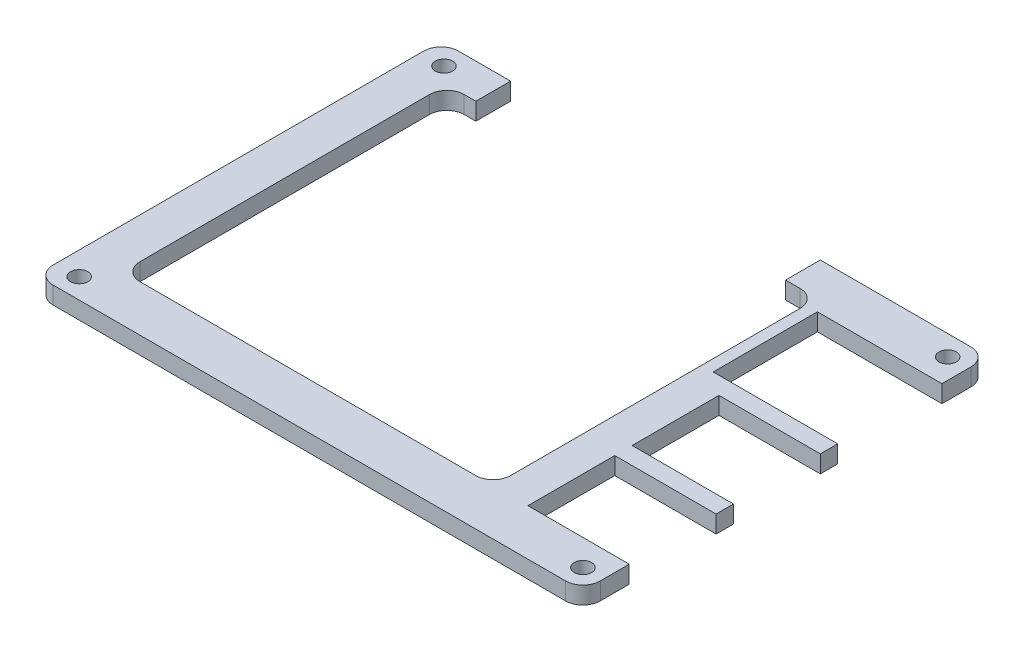
ISO-10303-21;
HEADER;
FILE_DESCRIPTION(('STEP AP214'),'2;1');
FILE_NAME('part.step','',(''),(''),'','','');
FILE_SCHEMA(('AUTOMOTIVE_DESIGN { 1 0 10303 214 1 1 1 1 }'));
ENDSEC;
DATA;
#1=APPLICATION_CONTEXT('core data for automotive mechanical design processes');
#2=APPLICATION_PROTOCOL_DEFINITION('international standard','automotive_design',2000,#1);
#3=PRODUCT_CONTEXT('',#1,'mechanical');
#4=PRODUCT('Part','Part','',(#3));
#5=PRODUCT_RELATED_PRODUCT_CATEGORY('part','',(#4));
#6=PRODUCT_DEFINITION_FORMATION('','',#4);
#7=PRODUCT_DEFINITION_CONTEXT('part definition',#1,'design');
#8=PRODUCT_DEFINITION('design','',#6,#7);
#9=PRODUCT_DEFINITION_SHAPE('','',#8);
#10=(LENGTH_UNIT() NAMED_UNIT(*) SI_UNIT(.MILLI.,.METRE.));
#11=(NAMED_UNIT(*) PLANE_ANGLE_UNIT() SI_UNIT($,.RADIAN.));
#12=(NAMED_UNIT(*) SI_UNIT($,.STERADIAN.) SOLID_ANGLE_UNIT());
#13=UNCERTAINTY_MEASURE_WITH_UNIT(LENGTH_MEASURE(1.E-05),#10,'distance_accuracy_value','');
#14=(GEOMETRIC_REPRESENTATION_CONTEXT(3) GLOBAL_UNCERTAINTY_ASSIGNED_CONTEXT((#13)) GLOBAL_UNIT_ASSIGNED_CONTEXT((#10,
#11,#12)) REPRESENTATION_CONTEXT('',''));
#15=CARTESIAN_POINT('',(0.,0.,0.));
#16=DIRECTION('',(0.,0.,1.));
#17=DIRECTION('',(1.,0.,0.));
#18=AXIS2_PLACEMENT_3D('',#15,#16,#17);
#19=CARTESIAN_POINT('',(47.25,3.,-35.));
#20=DIRECTION('',(-1.,0.,0.));
#21=DIRECTION('',(0.,0.,1.));
#22=AXIS2_PLACEMENT_3D('',#19,#20,#21);
#23=PLANE('',#22);
#24=DIRECTION('',(0.,0.,-1.));
#25=VECTOR('',#24,1.);
#26=CARTESIAN_POINT('',(47.25,3.,-35.));
#27=LINE('',#26,#25);
#28=CARTESIAN_POINT('',(47.25,3.,-27.));
#29=VERTEX_POINT('',#28);
#30=CARTESIAN_POINT('',(47.25,3.,-32.));
#31=VERTEX_POINT('',#30);
#32=EDGE_CURVE('E468',#29,#31,#27,.T.);
#33=ORIENTED_EDGE('',*,*,#32,.F.);
#34=DIRECTION('',(0.,1.,0.));
#35=VECTOR('',#34,1.);
#36=CARTESIAN_POINT('',(47.25,0.,-27.));
#37=LINE('',#36,#35);
#38=CARTESIAN_POINT('',(47.25,0.,-27.));
#39=VERTEX_POINT('',#38);
#40=EDGE_CURVE('E350',#39,#29,#37,.T.);
#41=ORIENTED_EDGE('',*,*,#40,.F.);
#42=DIRECTION('',(0.,0.,-1.));
#43=VECTOR('',#42,1.);
#44=CARTESIAN_POINT('',(47.25,0.,-35.));
#45=LINE('',#44,#43);
#46=CARTESIAN_POINT('',(47.25,0.,-32.));
#47=VERTEX_POINT('',#46);
#48=EDGE_CURVE('E458',#39,#47,#45,.T.);
#49=ORIENTED_EDGE('',*,*,#48,.T.);
#50=DIRECTION('',(0.,-1.,0.));
#51=VECTOR('',#50,1.);
#52=CARTESIAN_POINT('',(47.25,3.,-32.));
#53=LINE('',#52,#51);
#54=EDGE_CURVE('E550',#47,#31,#53,.F.);
#55=ORIENTED_EDGE('',*,*,#54,.T.);
#56=EDGE_LOOP('',(#33,#41,#49,#55));
#57=FACE_BOUND('',#56,.T.);
#58=ADVANCED_FACE('F39',(#57),#23,.F.);
#59=CARTESIAN_POINT('',(47.25,0.,-5.99999999999999));
#60=VERTEX_POINT('',#59);
#61=CARTESIAN_POINT('',(47.25,0.,-8.99999999999999));
#62=VERTEX_POINT('',#61);
#63=EDGE_CURVE('E608',#60,#62,#45,.T.);
#64=ORIENTED_EDGE('',*,*,#63,.T.);
#65=DIRECTION('',(0.,1.,0.));
#66=VECTOR('',#65,1.);
#67=CARTESIAN_POINT('',(47.25,0.,-8.99999999999999));
#68=LINE('',#67,#66);
#69=CARTESIAN_POINT('',(47.25,3.,-8.99999999999999));
#70=VERTEX_POINT('',#69);
#71=EDGE_CURVE('E353',#62,#70,#68,.T.);
#72=ORIENTED_EDGE('',*,*,#71,.T.);
#73=CARTESIAN_POINT('',(47.25,3.,-5.99999999999999));
#74=VERTEX_POINT('',#73);
#75=EDGE_CURVE('E601',#74,#70,#27,.T.);
#76=ORIENTED_EDGE('',*,*,#75,.F.);
#77=DIRECTION('',(0.,1.,0.));
#78=VECTOR('',#77,1.);
#79=CARTESIAN_POINT('',(47.25,0.,-5.99999999999999));
#80=LINE('',#79,#78);
#81=EDGE_CURVE('E386',#60,#74,#80,.T.);
#82=ORIENTED_EDGE('',*,*,#81,.F.);
#83=EDGE_LOOP('',(#64,#72,#76,#82));
#84=FACE_BOUND('',#83,.T.);
#85=ADVANCED_FACE('F639',(#84),#23,.F.);
#86=CARTESIAN_POINT('',(47.25,0.,12.));
#87=VERTEX_POINT('',#86);
#88=CARTESIAN_POINT('',(47.25,0.,9.00000000000001));
#89=VERTEX_POINT('',#88);
#90=EDGE_CURVE('E487',#87,#89,#45,.T.);
#91=ORIENTED_EDGE('',*,*,#90,.T.);
#92=DIRECTION('',(0.,1.,0.));
#93=VECTOR('',#92,1.);
#94=CARTESIAN_POINT('',(47.25,0.,9.00000000000001));
#95=LINE('',#94,#93);
#96=CARTESIAN_POINT('',(47.25,3.,9.00000000000001));
#97=VERTEX_POINT('',#96);
#98=EDGE_CURVE('E389',#89,#97,#95,.T.);
#99=ORIENTED_EDGE('',*,*,#98,.T.);
#100=CARTESIAN_POINT('',(47.25,3.,12.));
#101=VERTEX_POINT('',#100);
#102=EDGE_CURVE('E467',#101,#97,#27,.T.);
#103=ORIENTED_EDGE('',*,*,#102,.F.);
#104=DIRECTION('',(0.,1.,0.));
#105=VECTOR('',#104,1.);
#106=CARTESIAN_POINT('',(47.25,0.,12.));
#107=LINE('',#106,#105);
#108=EDGE_CURVE('E421',#87,#101,#107,.T.);
#109=ORIENTED_EDGE('',*,*,#108,.F.);
#110=EDGE_LOOP('',(#91,#99,#103,#109));
#111=FACE_BOUND('',#110,.T.);
#112=ADVANCED_FACE('F634',(#111),#23,.F.);
#113=CARTESIAN_POINT('',(-47.25,3.,-35.));
#114=DIRECTION('',(0.,0.,1.));
#115=DIRECTION('',(1.,0.,0.));
#116=AXIS2_PLACEMENT_3D('',#113,#114,#115);
#117=PLANE('',#116);
#118=DIRECTION('',(0.,1.,0.));
#119=VECTOR('',#118,1.);
#120=CARTESIAN_POINT('',(-35.25,0.,-35.));
#121=LINE('',#120,#119);
#122=CARTESIAN_POINT('',(-35.25,0.,-35.));
#123=VERTEX_POINT('',#122);
#124=CARTESIAN_POINT('',(-35.25,3.,-35.));
#125=VERTEX_POINT('',#124);
#126=EDGE_CURVE('E318',#123,#125,#121,.T.);
#127=ORIENTED_EDGE('',*,*,#126,.F.);
#128=DIRECTION('',(-1.,0.,0.));
#129=VECTOR('',#128,1.);
#130=CARTESIAN_POINT('',(-47.25,0.,-35.));
#131=LINE('',#130,#129);
#132=CARTESIAN_POINT('',(-44.25,0.,-35.));
#133=VERTEX_POINT('',#132);
#134=EDGE_CURVE('E486',#123,#133,#131,.T.);
#135=ORIENTED_EDGE('',*,*,#134,.T.);
#136=DIRECTION('',(0.,-1.,0.));
#137=VECTOR('',#136,1.);
#138=CARTESIAN_POINT('',(-44.25,3.,-35.));
#139=LINE('',#138,#137);
#140=CARTESIAN_POINT('',(-44.25,3.,-35.));
#141=VERTEX_POINT('',#140);
#142=EDGE_CURVE('E542',#133,#141,#139,.F.);
#143=ORIENTED_EDGE('',*,*,#142,.T.);
#144=DIRECTION('',(-1.,0.,0.));
#145=VECTOR('',#144,1.);
#146=CARTESIAN_POINT('',(-47.25,3.,-35.));
#147=LINE('',#146,#145);
#148=EDGE_CURVE('E466',#125,#141,#147,.T.);
#149=ORIENTED_EDGE('',*,*,#148,.F.);
#150=EDGE_LOOP('',(#127,#135,#143,#149));
#151=FACE_BOUND('',#150,.T.);
#152=ADVANCED_FACE('F626',(#151),#117,.F.);
#153=DIRECTION('',(0.,1.,0.));
#154=VECTOR('',#153,1.);
#155=CARTESIAN_POINT('',(18.25,0.,-35.));
#156=LINE('',#155,#154);
#157=CARTESIAN_POINT('',(18.25,0.,-35.));
#158=VERTEX_POINT('',#157);
#159=CARTESIAN_POINT('',(18.25,3.,-35.));
#160=VERTEX_POINT('',#159);
#161=EDGE_CURVE('E252',#158,#160,#156,.T.);
#162=ORIENTED_EDGE('',*,*,#161,.T.);
#163=CARTESIAN_POINT('',(44.25,3.,-35.));
#164=VERTEX_POINT('',#163);
#165=EDGE_CURVE('E469',#164,#160,#147,.T.);
#166=ORIENTED_EDGE('',*,*,#165,.F.);
#167=DIRECTION('',(0.,-1.,0.));
#168=VECTOR('',#167,1.);
#169=CARTESIAN_POINT('',(44.25,3.,-35.));
#170=LINE('',#169,#168);
#171=CARTESIAN_POINT('',(44.25,0.,-35.));
#172=VERTEX_POINT('',#171);
#173=EDGE_CURVE('E538',#164,#172,#170,.T.);
#174=ORIENTED_EDGE('',*,*,#173,.T.);
#175=EDGE_CURVE('E488',#172,#158,#131,.T.);
#176=ORIENTED_EDGE('',*,*,#175,.T.);
#177=EDGE_LOOP('',(#162,#166,#174,#176));
#178=FACE_BOUND('',#177,.T.);
#179=ADVANCED_FACE('F624',(#178),#117,.F.);
#180=CARTESIAN_POINT('',(0.,3.,0.));
#181=DIRECTION('',(0.,1.,0.));
#182=DIRECTION('',(0.,0.,1.));
#183=AXIS2_PLACEMENT_3D('',#180,#181,#182);
#184=PLANE('',#183);
#185=CARTESIAN_POINT('',(43.75,3.,31.5));
#186=DIRECTION('',(0.,1.,0.));
#187=DIRECTION('',(0.,0.,1.));
#188=AXIS2_PLACEMENT_3D('',#185,#186,#187);
#189=CIRCLE('',#188,1.5);
#190=CARTESIAN_POINT('',(43.75,3.,33.));
#191=VERTEX_POINT('',#190);
#192=EDGE_CURVE('E317',#191,#191,#189,.T.);
#193=ORIENTED_EDGE('',*,*,#192,.F.);
#194=EDGE_LOOP('',(#193));
#195=FACE_BOUND('',#194,.T.);
#196=CARTESIAN_POINT('',(-43.25,3.,31.5));
#197=DIRECTION('',(0.,1.,0.));
#198=DIRECTION('',(0.,0.,1.));
#199=AXIS2_PLACEMENT_3D('',#196,#197,#198);
#200=CIRCLE('',#199,1.5);
#201=CARTESIAN_POINT('',(-43.25,3.,33.));
#202=VERTEX_POINT('',#201);
#203=EDGE_CURVE('E443',#202,#202,#200,.T.);
#204=ORIENTED_EDGE('',*,*,#203,.F.);
#205=EDGE_LOOP('',(#204));
#206=FACE_BOUND('',#205,.T.);
#207=CARTESIAN_POINT('',(-43.25,3.,-31.5));
#208=DIRECTION('',(0.,1.,0.));
#209=DIRECTION('',(0.,0.,1.));
#210=AXIS2_PLACEMENT_3D('',#207,#208,#209);
#211=CIRCLE('',#210,1.5);
#212=CARTESIAN_POINT('',(-43.25,3.,-30.));
#213=VERTEX_POINT('',#212);
#214=EDGE_CURVE('E435',#213,#213,#211,.T.);
#215=ORIENTED_EDGE('',*,*,#214,.F.);
#216=EDGE_LOOP('',(#215));
#217=FACE_BOUND('',#216,.T.);
#218=CARTESIAN_POINT('',(43.75,3.,-31.5));
#219=DIRECTION('',(0.,1.,0.));
#220=DIRECTION('',(0.,0.,1.));
#221=AXIS2_PLACEMENT_3D('',#218,#219,#220);
#222=CIRCLE('',#221,1.5);
#223=CARTESIAN_POINT('',(43.75,3.,-30.));
#224=VERTEX_POINT('',#223);
#225=EDGE_CURVE('E434',#224,#224,#222,.T.);
#226=ORIENTED_EDGE('',*,*,#225,.F.);
#227=EDGE_LOOP('',(#226));
#228=FACE_BOUND('',#227,.T.);
#229=DIRECTION('',(0.,0.,-1.));
#230=VECTOR('',#229,1.);
#231=CARTESIAN_POINT('',(-40.25,3.,0.));
#232=LINE('',#231,#230);
#233=CARTESIAN_POINT('',(-40.25,3.,24.));
#234=VERTEX_POINT('',#233);
#235=CARTESIAN_POINT('',(-40.25,3.,-26.));
#236=VERTEX_POINT('',#235);
#237=EDGE_CURVE('E292',#234,#236,#232,.T.);
#238=ORIENTED_EDGE('',*,*,#237,.T.);
#239=CARTESIAN_POINT('',(-37.25,3.,-26.));
#240=DIRECTION('',(0.,1.,0.));
#241=DIRECTION('',(0.,0.,1.));
#242=AXIS2_PLACEMENT_3D('',#239,#240,#241);
#243=CIRCLE('',#242,3.);
#244=CARTESIAN_POINT('',(-37.25,3.,-29.));
#245=VERTEX_POINT('',#244);
#246=EDGE_CURVE('E48',#236,#245,#243,.F.);
#247=ORIENTED_EDGE('',*,*,#246,.T.);
#248=DIRECTION('',(1.,0.,0.));
#249=VECTOR('',#248,1.);
#250=CARTESIAN_POINT('',(0.,3.,-29.));
#251=LINE('',#250,#249);
#252=CARTESIAN_POINT('',(-35.25,3.,-29.));
#253=VERTEX_POINT('',#252);
#254=EDGE_CURVE('E307',#245,#253,#251,.T.);
#255=ORIENTED_EDGE('',*,*,#254,.T.);
#256=DIRECTION('',(0.,0.,-1.));
#257=VECTOR('',#256,1.);
#258=CARTESIAN_POINT('',(-35.25,3.,0.));
#259=LINE('',#258,#257);
#260=EDGE_CURVE('E310',#253,#125,#259,.T.);
#261=ORIENTED_EDGE('',*,*,#260,.T.);
#262=ORIENTED_EDGE('',*,*,#148,.T.);
#263=CARTESIAN_POINT('',(-44.25,3.,-32.));
#264=DIRECTION('',(0.,1.,0.));
#265=DIRECTION('',(0.,0.,1.));
#266=AXIS2_PLACEMENT_3D('',#263,#264,#265);
#267=CIRCLE('',#266,3.);
#268=CARTESIAN_POINT('',(-47.25,3.,-32.));
#269=VERTEX_POINT('',#268);
#270=EDGE_CURVE('E532',#141,#269,#267,.T.);
#271=ORIENTED_EDGE('',*,*,#270,.T.);
#272=DIRECTION('',(0.,0.,1.));
#273=VECTOR('',#272,1.);
#274=CARTESIAN_POINT('',(-47.25,3.,-35.));
#275=LINE('',#274,#273);
#276=CARTESIAN_POINT('',(-47.25,3.,32.));
#277=VERTEX_POINT('',#276);
#278=EDGE_CURVE('E473',#269,#277,#275,.T.);
#279=ORIENTED_EDGE('',*,*,#278,.T.);
#280=CARTESIAN_POINT('',(-44.25,3.,32.));
#281=DIRECTION('',(0.,1.,0.));
#282=DIRECTION('',(0.,0.,1.));
#283=AXIS2_PLACEMENT_3D('',#280,#281,#282);
#284=CIRCLE('',#283,3.);
#285=CARTESIAN_POINT('',(-44.25,3.,35.));
#286=VERTEX_POINT('',#285);
#287=EDGE_CURVE('E535',#277,#286,#284,.T.);
#288=ORIENTED_EDGE('',*,*,#287,.T.);
#289=DIRECTION('',(1.,0.,0.));
#290=VECTOR('',#289,1.);
#291=CARTESIAN_POINT('',(-47.25,3.,35.));
#292=LINE('',#291,#290);
#293=CARTESIAN_POINT('',(44.25,3.,35.));
#294=VERTEX_POINT('',#293);
#295=EDGE_CURVE('E477',#286,#294,#292,.T.);
#296=ORIENTED_EDGE('',*,*,#295,.T.);
#297=CARTESIAN_POINT('',(44.25,3.,32.));
#298=DIRECTION('',(0.,1.,0.));
#299=DIRECTION('',(0.,0.,1.));
#300=AXIS2_PLACEMENT_3D('',#297,#298,#299);
#301=CIRCLE('',#300,3.);
#302=CARTESIAN_POINT('',(47.25,3.,32.));
#303=VERTEX_POINT('',#302);
#304=EDGE_CURVE('E526',#294,#303,#301,.T.);
#305=ORIENTED_EDGE('',*,*,#304,.T.);
#306=CARTESIAN_POINT('',(47.25,3.,27.));
#307=VERTEX_POINT('',#306);
#308=EDGE_CURVE('E462',#303,#307,#27,.T.);
#309=ORIENTED_EDGE('',*,*,#308,.T.);
#310=DIRECTION('',(1.,0.,0.));
#311=VECTOR('',#310,1.);
#312=CARTESIAN_POINT('',(0.,3.,27.));
#313=LINE('',#312,#311);
#314=CARTESIAN_POINT('',(29.75,3.,27.));
#315=VERTEX_POINT('',#314);
#316=EDGE_CURVE('E413',#315,#307,#313,.T.);
#317=ORIENTED_EDGE('',*,*,#316,.F.);
#318=DIRECTION('',(0.,0.,1.));
#319=VECTOR('',#318,1.);
#320=CARTESIAN_POINT('',(29.75,3.,0.));
#321=LINE('',#320,#319);
#322=CARTESIAN_POINT('',(29.75,3.,12.));
#323=VERTEX_POINT('',#322);
#324=EDGE_CURVE('E409',#323,#315,#321,.T.);
#325=ORIENTED_EDGE('',*,*,#324,.F.);
#326=DIRECTION('',(-1.,0.,0.));
#327=VECTOR('',#326,1.);
#328=CARTESIAN_POINT('',(0.,3.,12.));
#329=LINE('',#328,#327);
#330=EDGE_CURVE('E400',#101,#323,#329,.T.);
#331=ORIENTED_EDGE('',*,*,#330,.F.);
#332=ORIENTED_EDGE('',*,*,#102,.T.);
#333=DIRECTION('',(1.,0.,0.));
#334=VECTOR('',#333,1.);
#335=CARTESIAN_POINT('',(0.,3.,9.00000000000001));
#336=LINE('',#335,#334);
#337=CARTESIAN_POINT('',(29.75,3.,9.00000000000001));
#338=VERTEX_POINT('',#337);
#339=EDGE_CURVE('E377',#338,#97,#336,.T.);
#340=ORIENTED_EDGE('',*,*,#339,.F.);
#341=DIRECTION('',(0.,0.,1.));
#342=VECTOR('',#341,1.);
#343=CARTESIAN_POINT('',(29.75,3.,0.));
#344=LINE('',#343,#342);
#345=CARTESIAN_POINT('',(29.75,3.,-5.99999999999999));
#346=VERTEX_POINT('',#345);
#347=EDGE_CURVE('E373',#346,#338,#344,.T.);
#348=ORIENTED_EDGE('',*,*,#347,.F.);
#349=DIRECTION('',(-1.,0.,0.));
#350=VECTOR('',#349,1.);
#351=CARTESIAN_POINT('',(0.,3.,-5.99999999999998));
#352=LINE('',#351,#350);
#353=EDGE_CURVE('E364',#74,#346,#352,.T.);
#354=ORIENTED_EDGE('',*,*,#353,.F.);
#355=ORIENTED_EDGE('',*,*,#75,.T.);
#356=DIRECTION('',(1.,0.,0.));
#357=VECTOR('',#356,1.);
#358=CARTESIAN_POINT('',(0.,3.,-8.99999999999999));
#359=LINE('',#358,#357);
#360=CARTESIAN_POINT('',(25.75,3.,-8.99999999999999));
#361=VERTEX_POINT('',#360);
#362=EDGE_CURVE('E341',#361,#70,#359,.T.);
#363=ORIENTED_EDGE('',*,*,#362,.F.);
#364=DIRECTION('',(0.,0.,1.));
#365=VECTOR('',#364,1.);
#366=CARTESIAN_POINT('',(25.75,3.,0.));
#367=LINE('',#366,#365);
#368=CARTESIAN_POINT('',(25.75,3.,-27.));
#369=VERTEX_POINT('',#368);
#370=EDGE_CURVE('E337',#369,#361,#367,.T.);
#371=ORIENTED_EDGE('',*,*,#370,.F.);
#372=DIRECTION('',(-1.,0.,0.));
#373=VECTOR('',#372,1.);
#374=CARTESIAN_POINT('',(0.,3.,-27.));
#375=LINE('',#374,#373);
#376=EDGE_CURVE('E328',#29,#369,#375,.T.);
#377=ORIENTED_EDGE('',*,*,#376,.F.);
#378=ORIENTED_EDGE('',*,*,#32,.T.);
#379=CARTESIAN_POINT('',(44.25,3.,-32.));
#380=DIRECTION('',(0.,1.,0.));
#381=DIRECTION('',(0.,0.,1.));
#382=AXIS2_PLACEMENT_3D('',#379,#380,#381);
#383=CIRCLE('',#382,3.);
#384=EDGE_CURVE('E529',#31,#164,#383,.T.);
#385=ORIENTED_EDGE('',*,*,#384,.T.);
#386=ORIENTED_EDGE('',*,*,#165,.T.);
#387=DIRECTION('',(0.,0.,1.));
#388=VECTOR('',#387,1.);
#389=CARTESIAN_POINT('',(18.25,3.,0.));
#390=LINE('',#389,#388);
#391=CARTESIAN_POINT('',(18.25,3.,-29.));
#392=VERTEX_POINT('',#391);
#393=EDGE_CURVE('E306',#160,#392,#390,.T.);
#394=ORIENTED_EDGE('',*,*,#393,.T.);
#395=CARTESIAN_POINT('',(20.75,3.,-29.));
#396=VERTEX_POINT('',#395);
#397=EDGE_CURVE('E267',#392,#396,#251,.T.);
#398=ORIENTED_EDGE('',*,*,#397,.T.);
#399=CARTESIAN_POINT('',(20.75,3.,-26.));
#400=DIRECTION('',(0.,1.,0.));
#401=DIRECTION('',(0.,0.,1.));
#402=AXIS2_PLACEMENT_3D('',#399,#400,#401);
#403=CIRCLE('',#402,3.);
#404=CARTESIAN_POINT('',(23.75,3.,-26.));
#405=VERTEX_POINT('',#404);
#406=EDGE_CURVE('E580',#396,#405,#403,.F.);
#407=ORIENTED_EDGE('',*,*,#406,.T.);
#408=DIRECTION('',(0.,0.,1.));
#409=VECTOR('',#408,1.);
#410=CARTESIAN_POINT('',(23.75,3.,0.));
#411=LINE('',#410,#409);
#412=CARTESIAN_POINT('',(23.75,3.,24.));
#413=VERTEX_POINT('',#412);
#414=EDGE_CURVE('E300',#405,#413,#411,.T.);
#415=ORIENTED_EDGE('',*,*,#414,.T.);
#416=CARTESIAN_POINT('',(20.75,3.,24.));
#417=DIRECTION('',(0.,1.,0.));
#418=DIRECTION('',(0.,0.,1.));
#419=AXIS2_PLACEMENT_3D('',#416,#417,#418);
#420=CIRCLE('',#419,3.);
#421=CARTESIAN_POINT('',(20.75,3.,27.));
#422=VERTEX_POINT('',#421);
#423=EDGE_CURVE('E585',#413,#422,#420,.F.);
#424=ORIENTED_EDGE('',*,*,#423,.T.);
#425=DIRECTION('',(-1.,0.,0.));
#426=VECTOR('',#425,1.);
#427=CARTESIAN_POINT('',(0.,3.,27.));
#428=LINE('',#427,#426);
#429=CARTESIAN_POINT('',(-37.25,3.,27.));
#430=VERTEX_POINT('',#429);
#431=EDGE_CURVE('E295',#422,#430,#428,.T.);
#432=ORIENTED_EDGE('',*,*,#431,.T.);
#433=CARTESIAN_POINT('',(-37.25,3.,24.));
#434=DIRECTION('',(0.,1.,0.));
#435=DIRECTION('',(0.,0.,1.));
#436=AXIS2_PLACEMENT_3D('',#433,#434,#435);
#437=CIRCLE('',#436,3.);
#438=EDGE_CURVE('E591',#430,#234,#437,.F.);
#439=ORIENTED_EDGE('',*,*,#438,.T.);
#440=EDGE_LOOP('',(#238,#247,#255,#261,#262,#271,#279,#288,#296,#305,#309,#317,#325,#331,#332,
#340,#348,#354,#355,#363,#371,#377,#378,#385,#386,#394,#398,#407,#415,#424,#432,#439));
#441=FACE_BOUND('',#440,.T.);
#442=ADVANCED_FACE('F621',(#195,#206,#217,#228,#441),#184,.T.);
#443=CARTESIAN_POINT('',(0.,0.,0.));
#444=DIRECTION('',(0.,1.,0.));
#445=DIRECTION('',(0.,0.,1.));
#446=AXIS2_PLACEMENT_3D('',#443,#444,#445);
#447=PLANE('',#446);
#448=CARTESIAN_POINT('',(43.75,0.,-31.5));
#449=DIRECTION('',(0.,1.,0.));
#450=DIRECTION('',(0.,0.,1.));
#451=AXIS2_PLACEMENT_3D('',#448,#449,#450);
#452=CIRCLE('',#451,1.5);
#453=CARTESIAN_POINT('',(43.75,0.,-30.));
#454=VERTEX_POINT('',#453);
#455=EDGE_CURVE('E454',#454,#454,#452,.T.);
#456=ORIENTED_EDGE('',*,*,#455,.T.);
#457=EDGE_LOOP('',(#456));
#458=FACE_BOUND('',#457,.T.);
#459=CARTESIAN_POINT('',(-43.25,0.,-31.5));
#460=DIRECTION('',(0.,1.,0.));
#461=DIRECTION('',(0.,0.,1.));
#462=AXIS2_PLACEMENT_3D('',#459,#460,#461);
#463=CIRCLE('',#462,1.5);
#464=CARTESIAN_POINT('',(-43.25,0.,-30.));
#465=VERTEX_POINT('',#464);
#466=EDGE_CURVE('E430',#465,#465,#463,.T.);
#467=ORIENTED_EDGE('',*,*,#466,.T.);
#468=EDGE_LOOP('',(#467));
#469=FACE_BOUND('',#468,.T.);
#470=CARTESIAN_POINT('',(-43.25,0.,31.5));
#471=DIRECTION('',(0.,1.,0.));
#472=DIRECTION('',(0.,0.,1.));
#473=AXIS2_PLACEMENT_3D('',#470,#471,#472);
#474=CIRCLE('',#473,1.5);
#475=CARTESIAN_POINT('',(-43.25,0.,33.));
#476=VERTEX_POINT('',#475);
#477=EDGE_CURVE('E439',#476,#476,#474,.T.);
#478=ORIENTED_EDGE('',*,*,#477,.T.);
#479=EDGE_LOOP('',(#478));
#480=FACE_BOUND('',#479,.T.);
#481=CARTESIAN_POINT('',(43.75,0.,31.5));
#482=DIRECTION('',(0.,1.,0.));
#483=DIRECTION('',(0.,0.,1.));
#484=AXIS2_PLACEMENT_3D('',#481,#482,#483);
#485=CIRCLE('',#484,1.5);
#486=CARTESIAN_POINT('',(43.75,0.,33.));
#487=VERTEX_POINT('',#486);
#488=EDGE_CURVE('E447',#487,#487,#485,.T.);
#489=ORIENTED_EDGE('',*,*,#488,.T.);
#490=EDGE_LOOP('',(#489));
#491=FACE_BOUND('',#490,.T.);
#492=DIRECTION('',(0.,0.,-1.));
#493=VECTOR('',#492,1.);
#494=CARTESIAN_POINT('',(-35.25,0.,0.));
#495=LINE('',#494,#493);
#496=CARTESIAN_POINT('',(-35.25,0.,-29.));
#497=VERTEX_POINT('',#496);
#498=EDGE_CURVE('E258',#497,#123,#495,.T.);
#499=ORIENTED_EDGE('',*,*,#498,.F.);
#500=DIRECTION('',(1.,0.,0.));
#501=VECTOR('',#500,1.);
#502=CARTESIAN_POINT('',(0.,0.,-29.));
#503=LINE('',#502,#501);
#504=CARTESIAN_POINT('',(-37.25,0.,-29.));
#505=VERTEX_POINT('',#504);
#506=EDGE_CURVE('E270',#505,#497,#503,.T.);
#507=ORIENTED_EDGE('',*,*,#506,.F.);
#508=CARTESIAN_POINT('',(-37.25,0.,-26.));
#509=DIRECTION('',(0.,1.,0.));
#510=DIRECTION('',(0.,0.,1.));
#511=AXIS2_PLACEMENT_3D('',#508,#509,#510);
#512=CIRCLE('',#511,3.);
#513=CARTESIAN_POINT('',(-40.25,0.,-26.));
#514=VERTEX_POINT('',#513);
#515=EDGE_CURVE('E11',#505,#514,#512,.T.);
#516=ORIENTED_EDGE('',*,*,#515,.T.);
#517=DIRECTION('',(0.,0.,-1.));
#518=VECTOR('',#517,1.);
#519=CARTESIAN_POINT('',(-40.25,0.,0.));
#520=LINE('',#519,#518);
#521=CARTESIAN_POINT('',(-40.25,0.,24.));
#522=VERTEX_POINT('',#521);
#523=EDGE_CURVE('E708',#522,#514,#520,.T.);
#524=ORIENTED_EDGE('',*,*,#523,.F.);
#525=CARTESIAN_POINT('',(-37.25,0.,24.));
#526=DIRECTION('',(0.,1.,0.));
#527=DIRECTION('',(0.,0.,1.));
#528=AXIS2_PLACEMENT_3D('',#525,#526,#527);
#529=CIRCLE('',#528,3.);
#530=CARTESIAN_POINT('',(-37.25,0.,27.));
#531=VERTEX_POINT('',#530);
#532=EDGE_CURVE('E594',#522,#531,#529,.T.);
#533=ORIENTED_EDGE('',*,*,#532,.T.);
#534=DIRECTION('',(-1.,0.,0.));
#535=VECTOR('',#534,1.);
#536=CARTESIAN_POINT('',(0.,0.,27.));
#537=LINE('',#536,#535);
#538=CARTESIAN_POINT('',(20.75,0.,27.));
#539=VERTEX_POINT('',#538);
#540=EDGE_CURVE('E282',#539,#531,#537,.T.);
#541=ORIENTED_EDGE('',*,*,#540,.F.);
#542=CARTESIAN_POINT('',(20.75,0.,24.));
#543=DIRECTION('',(0.,1.,0.));
#544=DIRECTION('',(0.,0.,1.));
#545=AXIS2_PLACEMENT_3D('',#542,#543,#544);
#546=CIRCLE('',#545,3.);
#547=CARTESIAN_POINT('',(23.75,0.,24.));
#548=VERTEX_POINT('',#547);
#549=EDGE_CURVE('E588',#539,#548,#546,.T.);
#550=ORIENTED_EDGE('',*,*,#549,.T.);
#551=DIRECTION('',(0.,0.,1.));
#552=VECTOR('',#551,1.);
#553=CARTESIAN_POINT('',(23.75,0.,0.));
#554=LINE('',#553,#552);
#555=CARTESIAN_POINT('',(23.75,0.,-26.));
#556=VERTEX_POINT('',#555);
#557=EDGE_CURVE('E278',#556,#548,#554,.T.);
#558=ORIENTED_EDGE('',*,*,#557,.F.);
#559=CARTESIAN_POINT('',(20.75,0.,-26.));
#560=DIRECTION('',(0.,1.,0.));
#561=DIRECTION('',(0.,0.,1.));
#562=AXIS2_PLACEMENT_3D('',#559,#560,#561);
#563=CIRCLE('',#562,3.);
#564=CARTESIAN_POINT('',(20.75,0.,-29.));
#565=VERTEX_POINT('',#564);
#566=EDGE_CURVE('E276',#556,#565,#563,.T.);
#567=ORIENTED_EDGE('',*,*,#566,.T.);
#568=CARTESIAN_POINT('',(18.25,0.,-29.));
#569=VERTEX_POINT('',#568);
#570=EDGE_CURVE('E259',#569,#565,#503,.T.);
#571=ORIENTED_EDGE('',*,*,#570,.F.);
#572=DIRECTION('',(0.,0.,1.));
#573=VECTOR('',#572,1.);
#574=CARTESIAN_POINT('',(18.25,0.,0.));
#575=LINE('',#574,#573);
#576=EDGE_CURVE('E246',#158,#569,#575,.T.);
#577=ORIENTED_EDGE('',*,*,#576,.F.);
#578=ORIENTED_EDGE('',*,*,#175,.F.);
#579=CARTESIAN_POINT('',(44.25,0.,-32.));
#580=DIRECTION('',(0.,1.,0.));
#581=DIRECTION('',(0.,0.,1.));
#582=AXIS2_PLACEMENT_3D('',#579,#580,#581);
#583=CIRCLE('',#582,3.);
#584=EDGE_CURVE('E508',#172,#47,#583,.F.);
#585=ORIENTED_EDGE('',*,*,#584,.T.);
#586=ORIENTED_EDGE('',*,*,#48,.F.);
#587=DIRECTION('',(-1.,0.,0.));
#588=VECTOR('',#587,1.);
#589=CARTESIAN_POINT('',(0.,0.,-27.));
#590=LINE('',#589,#588);
#591=CARTESIAN_POINT('',(25.75,0.,-27.));
#592=VERTEX_POINT('',#591);
#593=EDGE_CURVE('E332',#39,#592,#590,.T.);
#594=ORIENTED_EDGE('',*,*,#593,.T.);
#595=DIRECTION('',(0.,0.,1.));
#596=VECTOR('',#595,1.);
#597=CARTESIAN_POINT('',(25.75,0.,0.));
#598=LINE('',#597,#596);
#599=CARTESIAN_POINT('',(25.75,0.,-8.99999999999999));
#600=VERTEX_POINT('',#599);
#601=EDGE_CURVE('E323',#592,#600,#598,.T.);
#602=ORIENTED_EDGE('',*,*,#601,.T.);
#603=DIRECTION('',(1.,0.,0.));
#604=VECTOR('',#603,1.);
#605=CARTESIAN_POINT('',(0.,0.,-8.99999999999999));
#606=LINE('',#605,#604);
#607=EDGE_CURVE('E327',#600,#62,#606,.T.);
#608=ORIENTED_EDGE('',*,*,#607,.T.);
#609=ORIENTED_EDGE('',*,*,#63,.F.);
#610=DIRECTION('',(-1.,0.,0.));
#611=VECTOR('',#610,1.);
#612=CARTESIAN_POINT('',(0.,0.,-5.99999999999998));
#613=LINE('',#612,#611);
#614=CARTESIAN_POINT('',(29.75,0.,-5.99999999999999));
#615=VERTEX_POINT('',#614);
#616=EDGE_CURVE('E368',#60,#615,#613,.T.);
#617=ORIENTED_EDGE('',*,*,#616,.T.);
#618=DIRECTION('',(0.,0.,1.));
#619=VECTOR('',#618,1.);
#620=CARTESIAN_POINT('',(29.75,0.,0.));
#621=LINE('',#620,#619);
#622=CARTESIAN_POINT('',(29.75,0.,9.00000000000001));
#623=VERTEX_POINT('',#622);
#624=EDGE_CURVE('E359',#615,#623,#621,.T.);
#625=ORIENTED_EDGE('',*,*,#624,.T.);
#626=DIRECTION('',(1.,0.,0.));
#627=VECTOR('',#626,1.);
#628=CARTESIAN_POINT('',(0.,0.,9.00000000000001));
#629=LINE('',#628,#627);
#630=EDGE_CURVE('E363',#623,#89,#629,.T.);
#631=ORIENTED_EDGE('',*,*,#630,.T.);
#632=ORIENTED_EDGE('',*,*,#90,.F.);
#633=DIRECTION('',(-1.,0.,0.));
#634=VECTOR('',#633,1.);
#635=CARTESIAN_POINT('',(0.,0.,12.));
#636=LINE('',#635,#634);
#637=CARTESIAN_POINT('',(29.75,0.,12.));
#638=VERTEX_POINT('',#637);
#639=EDGE_CURVE('E404',#87,#638,#636,.T.);
#640=ORIENTED_EDGE('',*,*,#639,.T.);
#641=DIRECTION('',(0.,0.,1.));
#642=VECTOR('',#641,1.);
#643=CARTESIAN_POINT('',(29.75,0.,0.));
#644=LINE('',#643,#642);
#645=CARTESIAN_POINT('',(29.75,0.,27.));
#646=VERTEX_POINT('',#645);
#647=EDGE_CURVE('E395',#638,#646,#644,.T.);
#648=ORIENTED_EDGE('',*,*,#647,.T.);
#649=DIRECTION('',(1.,0.,0.));
#650=VECTOR('',#649,1.);
#651=CARTESIAN_POINT('',(0.,0.,27.));
#652=LINE('',#651,#650);
#653=CARTESIAN_POINT('',(47.25,0.,27.));
#654=VERTEX_POINT('',#653);
#655=EDGE_CURVE('E399',#646,#654,#652,.T.);
#656=ORIENTED_EDGE('',*,*,#655,.T.);
#657=CARTESIAN_POINT('',(47.25,0.,32.));
#658=VERTEX_POINT('',#657);
#659=EDGE_CURVE('E482',#658,#654,#45,.T.);
#660=ORIENTED_EDGE('',*,*,#659,.F.);
#661=CARTESIAN_POINT('',(44.25,0.,32.));
#662=DIRECTION('',(0.,1.,0.));
#663=DIRECTION('',(0.,0.,1.));
#664=AXIS2_PLACEMENT_3D('',#661,#662,#663);
#665=CIRCLE('',#664,3.);
#666=CARTESIAN_POINT('',(44.25,0.,35.));
#667=VERTEX_POINT('',#666);
#668=EDGE_CURVE('E505',#658,#667,#665,.F.);
#669=ORIENTED_EDGE('',*,*,#668,.T.);
#670=DIRECTION('',(1.,0.,0.));
#671=VECTOR('',#670,1.);
#672=CARTESIAN_POINT('',(-47.25,0.,35.));
#673=LINE('',#672,#671);
#674=CARTESIAN_POINT('',(-44.25,0.,35.));
#675=VERTEX_POINT('',#674);
#676=EDGE_CURVE('E495',#675,#667,#673,.T.);
#677=ORIENTED_EDGE('',*,*,#676,.F.);
#678=CARTESIAN_POINT('',(-44.25,0.,32.));
#679=DIRECTION('',(0.,1.,0.));
#680=DIRECTION('',(0.,0.,1.));
#681=AXIS2_PLACEMENT_3D('',#678,#679,#680);
#682=CIRCLE('',#681,3.);
#683=CARTESIAN_POINT('',(-47.25,0.,32.));
#684=VERTEX_POINT('',#683);
#685=EDGE_CURVE('E516',#675,#684,#682,.F.);
#686=ORIENTED_EDGE('',*,*,#685,.T.);
#687=DIRECTION('',(0.,0.,1.));
#688=VECTOR('',#687,1.);
#689=CARTESIAN_POINT('',(-47.25,0.,-35.));
#690=LINE('',#689,#688);
#691=CARTESIAN_POINT('',(-47.25,0.,-32.));
#692=VERTEX_POINT('',#691);
#693=EDGE_CURVE('E491',#692,#684,#690,.T.);
#694=ORIENTED_EDGE('',*,*,#693,.F.);
#695=CARTESIAN_POINT('',(-44.25,0.,-32.));
#696=DIRECTION('',(0.,1.,0.));
#697=DIRECTION('',(0.,0.,1.));
#698=AXIS2_PLACEMENT_3D('',#695,#696,#697);
#699=CIRCLE('',#698,3.);
#700=EDGE_CURVE('E512',#692,#133,#699,.F.);
#701=ORIENTED_EDGE('',*,*,#700,.T.);
#702=ORIENTED_EDGE('',*,*,#134,.F.);
#703=EDGE_LOOP('',(#499,#507,#516,#524,#533,#541,#550,#558,#567,#571,#577,#578,#585,#586,#594,
#602,#608,#609,#617,#625,#631,#632,#640,#648,#656,#660,#669,#677,#686,#694,#701,#702));
#704=FACE_BOUND('',#703,.T.);
#705=ADVANCED_FACE('F273',(#458,#469,#480,#491,#704),#447,.F.);
#706=ORIENTED_EDGE('',*,*,#659,.T.);
#707=DIRECTION('',(0.,1.,0.));
#708=VECTOR('',#707,1.);
#709=CARTESIAN_POINT('',(47.25,0.,27.));
#710=LINE('',#709,#708);
#711=EDGE_CURVE('E424',#654,#307,#710,.T.);
#712=ORIENTED_EDGE('',*,*,#711,.T.);
#713=ORIENTED_EDGE('',*,*,#308,.F.);
#714=DIRECTION('',(0.,-1.,0.));
#715=VECTOR('',#714,1.);
#716=CARTESIAN_POINT('',(47.25,3.,32.));
#717=LINE('',#716,#715);
#718=EDGE_CURVE('E546',#303,#658,#717,.T.);
#719=ORIENTED_EDGE('',*,*,#718,.T.);
#720=EDGE_LOOP('',(#706,#712,#713,#719));
#721=FACE_BOUND('',#720,.T.);
#722=ADVANCED_FACE('F640',(#721),#23,.F.);
#723=CARTESIAN_POINT('',(-47.25,3.,-35.));
#724=DIRECTION('',(1.,0.,0.));
#725=DIRECTION('',(0.,0.,-1.));
#726=AXIS2_PLACEMENT_3D('',#723,#724,#725);
#727=PLANE('',#726);
#728=ORIENTED_EDGE('',*,*,#693,.T.);
#729=DIRECTION('',(0.,-1.,0.));
#730=VECTOR('',#729,1.);
#731=CARTESIAN_POINT('',(-47.25,3.,32.));
#732=LINE('',#731,#730);
#733=EDGE_CURVE('E523',#684,#277,#732,.F.);
#734=ORIENTED_EDGE('',*,*,#733,.T.);
#735=ORIENTED_EDGE('',*,*,#278,.F.);
#736=DIRECTION('',(0.,-1.,0.));
#737=VECTOR('',#736,1.);
#738=CARTESIAN_POINT('',(-47.25,3.,-32.));
#739=LINE('',#738,#737);
#740=EDGE_CURVE('E519',#269,#692,#739,.T.);
#741=ORIENTED_EDGE('',*,*,#740,.T.);
#742=EDGE_LOOP('',(#728,#734,#735,#741));
#743=FACE_BOUND('',#742,.T.);
#744=ADVANCED_FACE('F647',(#743),#727,.F.);
#745=CARTESIAN_POINT('',(-47.25,3.,35.));
#746=DIRECTION('',(0.,0.,-1.));
#747=DIRECTION('',(-1.,0.,0.));
#748=AXIS2_PLACEMENT_3D('',#745,#746,#747);
#749=PLANE('',#748);
#750=ORIENTED_EDGE('',*,*,#295,.F.);
#751=DIRECTION('',(0.,-1.,0.));
#752=VECTOR('',#751,1.);
#753=CARTESIAN_POINT('',(-44.25,3.,35.));
#754=LINE('',#753,#752);
#755=EDGE_CURVE('E501',#286,#675,#754,.T.);
#756=ORIENTED_EDGE('',*,*,#755,.T.);
#757=ORIENTED_EDGE('',*,*,#676,.T.);
#758=DIRECTION('',(0.,-1.,0.));
#759=VECTOR('',#758,1.);
#760=CARTESIAN_POINT('',(44.25,3.,35.));
#761=LINE('',#760,#759);
#762=EDGE_CURVE('E481',#667,#294,#761,.F.);
#763=ORIENTED_EDGE('',*,*,#762,.T.);
#764=EDGE_LOOP('',(#750,#756,#757,#763));
#765=FACE_BOUND('',#764,.T.);
#766=ADVANCED_FACE('F653',(#765),#749,.F.);
#767=CARTESIAN_POINT('',(43.75,0.,-31.5));
#768=DIRECTION('',(0.,1.,0.));
#769=DIRECTION('',(0.,0.,1.));
#770=AXIS2_PLACEMENT_3D('',#767,#768,#769);
#771=CYLINDRICAL_SURFACE('',#770,1.5);
#772=ORIENTED_EDGE('',*,*,#455,.F.);
#773=EDGE_LOOP('',(#772));
#774=FACE_BOUND('',#773,.T.);
#775=ORIENTED_EDGE('',*,*,#225,.T.);
#776=EDGE_LOOP('',(#775));
#777=FACE_BOUND('',#776,.T.);
#778=ADVANCED_FACE('F770',(#774,#777),#771,.F.);
#779=CARTESIAN_POINT('',(-43.25,0.,-31.5));
#780=DIRECTION('',(0.,1.,0.));
#781=DIRECTION('',(0.,0.,1.));
#782=AXIS2_PLACEMENT_3D('',#779,#780,#781);
#783=CYLINDRICAL_SURFACE('',#782,1.5);
#784=ORIENTED_EDGE('',*,*,#466,.F.);
#785=EDGE_LOOP('',(#784));
#786=FACE_BOUND('',#785,.T.);
#787=ORIENTED_EDGE('',*,*,#214,.T.);
#788=EDGE_LOOP('',(#787));
#789=FACE_BOUND('',#788,.T.);
#790=ADVANCED_FACE('F766',(#786,#789),#783,.F.);
#791=CARTESIAN_POINT('',(-43.25,0.,31.5));
#792=DIRECTION('',(0.,1.,0.));
#793=DIRECTION('',(0.,0.,1.));
#794=AXIS2_PLACEMENT_3D('',#791,#792,#793);
#795=CYLINDRICAL_SURFACE('',#794,1.5);
#796=ORIENTED_EDGE('',*,*,#477,.F.);
#797=EDGE_LOOP('',(#796));
#798=FACE_BOUND('',#797,.T.);
#799=ORIENTED_EDGE('',*,*,#203,.T.);
#800=EDGE_LOOP('',(#799));
#801=FACE_BOUND('',#800,.T.);
#802=ADVANCED_FACE('F769',(#798,#801),#795,.F.);
#803=CARTESIAN_POINT('',(43.75,0.,31.5));
#804=DIRECTION('',(0.,1.,0.));
#805=DIRECTION('',(0.,0.,1.));
#806=AXIS2_PLACEMENT_3D('',#803,#804,#805);
#807=CYLINDRICAL_SURFACE('',#806,1.5);
#808=ORIENTED_EDGE('',*,*,#488,.F.);
#809=EDGE_LOOP('',(#808));
#810=FACE_BOUND('',#809,.T.);
#811=ORIENTED_EDGE('',*,*,#192,.T.);
#812=EDGE_LOOP('',(#811));
#813=FACE_BOUND('',#812,.T.);
#814=ADVANCED_FACE('F774',(#810,#813),#807,.F.);
#815=CARTESIAN_POINT('',(-44.25,3.,32.));
#816=DIRECTION('',(0.,-1.,0.));
#817=DIRECTION('',(0.,0.,-1.));
#818=AXIS2_PLACEMENT_3D('',#815,#816,#817);
#819=CYLINDRICAL_SURFACE('',#818,3.);
#820=ORIENTED_EDGE('',*,*,#287,.F.);
#821=ORIENTED_EDGE('',*,*,#733,.F.);
#822=ORIENTED_EDGE('',*,*,#685,.F.);
#823=ORIENTED_EDGE('',*,*,#755,.F.);
#824=EDGE_LOOP('',(#820,#821,#822,#823));
#825=FACE_BOUND('',#824,.T.);
#826=ADVANCED_FACE('F694',(#825),#819,.T.);
#827=CARTESIAN_POINT('',(-44.25,3.,-32.));
#828=DIRECTION('',(0.,-1.,0.));
#829=DIRECTION('',(0.,0.,-1.));
#830=AXIS2_PLACEMENT_3D('',#827,#828,#829);
#831=CYLINDRICAL_SURFACE('',#830,3.);
#832=ORIENTED_EDGE('',*,*,#270,.F.);
#833=ORIENTED_EDGE('',*,*,#142,.F.);
#834=ORIENTED_EDGE('',*,*,#700,.F.);
#835=ORIENTED_EDGE('',*,*,#740,.F.);
#836=EDGE_LOOP('',(#832,#833,#834,#835));
#837=FACE_BOUND('',#836,.T.);
#838=ADVANCED_FACE('F701',(#837),#831,.T.);
#839=CARTESIAN_POINT('',(44.25,3.,-32.));
#840=DIRECTION('',(0.,-1.,0.));
#841=DIRECTION('',(0.,0.,-1.));
#842=AXIS2_PLACEMENT_3D('',#839,#840,#841);
#843=CYLINDRICAL_SURFACE('',#842,3.);
#844=ORIENTED_EDGE('',*,*,#384,.F.);
#845=ORIENTED_EDGE('',*,*,#54,.F.);
#846=ORIENTED_EDGE('',*,*,#584,.F.);
#847=ORIENTED_EDGE('',*,*,#173,.F.);
#848=EDGE_LOOP('',(#844,#845,#846,#847));
#849=FACE_BOUND('',#848,.T.);
#850=ADVANCED_FACE('F619',(#849),#843,.T.);
#851=CARTESIAN_POINT('',(44.25,3.,32.));
#852=DIRECTION('',(0.,-1.,0.));
#853=DIRECTION('',(0.,0.,-1.));
#854=AXIS2_PLACEMENT_3D('',#851,#852,#853);
#855=CYLINDRICAL_SURFACE('',#854,3.);
#856=ORIENTED_EDGE('',*,*,#304,.F.);
#857=ORIENTED_EDGE('',*,*,#762,.F.);
#858=ORIENTED_EDGE('',*,*,#668,.F.);
#859=ORIENTED_EDGE('',*,*,#718,.F.);
#860=EDGE_LOOP('',(#856,#857,#858,#859));
#861=FACE_BOUND('',#860,.T.);
#862=ADVANCED_FACE('F686',(#861),#855,.T.);
#863=CARTESIAN_POINT('',(29.75,0.,0.));
#864=DIRECTION('',(-1.,0.,0.));
#865=DIRECTION('',(0.,0.,1.));
#866=AXIS2_PLACEMENT_3D('',#863,#864,#865);
#867=PLANE('',#866);
#868=ORIENTED_EDGE('',*,*,#324,.T.);
#869=DIRECTION('',(0.,1.,0.));
#870=VECTOR('',#869,1.);
#871=CARTESIAN_POINT('',(29.75,0.,27.));
#872=LINE('',#871,#870);
#873=EDGE_CURVE('E408',#646,#315,#872,.T.);
#874=ORIENTED_EDGE('',*,*,#873,.F.);
#875=ORIENTED_EDGE('',*,*,#647,.F.);
#876=DIRECTION('',(0.,1.,0.));
#877=VECTOR('',#876,1.);
#878=CARTESIAN_POINT('',(29.75,0.,12.));
#879=LINE('',#878,#877);
#880=EDGE_CURVE('E378',#638,#323,#879,.T.);
#881=ORIENTED_EDGE('',*,*,#880,.T.);
#882=EDGE_LOOP('',(#868,#874,#875,#881));
#883=FACE_BOUND('',#882,.T.);
#884=ADVANCED_FACE('F678',(#883),#867,.F.);
#885=CARTESIAN_POINT('',(0.,0.,12.));
#886=DIRECTION('',(0.,0.,-1.));
#887=DIRECTION('',(-1.,0.,0.));
#888=AXIS2_PLACEMENT_3D('',#885,#886,#887);
#889=PLANE('',#888);
#890=ORIENTED_EDGE('',*,*,#330,.T.);
#891=ORIENTED_EDGE('',*,*,#880,.F.);
#892=ORIENTED_EDGE('',*,*,#639,.F.);
#893=ORIENTED_EDGE('',*,*,#108,.T.);
#894=EDGE_LOOP('',(#890,#891,#892,#893));
#895=FACE_BOUND('',#894,.T.);
#896=ADVANCED_FACE('F675',(#895),#889,.F.);
#897=CARTESIAN_POINT('',(0.,0.,27.));
#898=DIRECTION('',(0.,0.,1.));
#899=DIRECTION('',(1.,0.,0.));
#900=AXIS2_PLACEMENT_3D('',#897,#898,#899);
#901=PLANE('',#900);
#902=ORIENTED_EDGE('',*,*,#316,.T.);
#903=ORIENTED_EDGE('',*,*,#711,.F.);
#904=ORIENTED_EDGE('',*,*,#655,.F.);
#905=ORIENTED_EDGE('',*,*,#873,.T.);
#906=EDGE_LOOP('',(#902,#903,#904,#905));
#907=FACE_BOUND('',#906,.T.);
#908=ADVANCED_FACE('F758',(#907),#901,.F.);
#909=CARTESIAN_POINT('',(29.75,0.,0.));
#910=DIRECTION('',(-1.,0.,0.));
#911=DIRECTION('',(0.,0.,1.));
#912=AXIS2_PLACEMENT_3D('',#909,#910,#911);
#913=PLANE('',#912);
#914=ORIENTED_EDGE('',*,*,#347,.T.);
#915=DIRECTION('',(0.,1.,0.));
#916=VECTOR('',#915,1.);
#917=CARTESIAN_POINT('',(29.75,0.,9.00000000000001));
#918=LINE('',#917,#916);
#919=EDGE_CURVE('E372',#623,#338,#918,.T.);
#920=ORIENTED_EDGE('',*,*,#919,.F.);
#921=ORIENTED_EDGE('',*,*,#624,.F.);
#922=DIRECTION('',(0.,1.,0.));
#923=VECTOR('',#922,1.);
#924=CARTESIAN_POINT('',(29.75,0.,-5.99999999999999));
#925=LINE('',#924,#923);
#926=EDGE_CURVE('E342',#615,#346,#925,.T.);
#927=ORIENTED_EDGE('',*,*,#926,.T.);
#928=EDGE_LOOP('',(#914,#920,#921,#927));
#929=FACE_BOUND('',#928,.T.);
#930=ADVANCED_FACE('F752',(#929),#913,.F.);
#931=CARTESIAN_POINT('',(0.,0.,-5.99999999999998));
#932=DIRECTION('',(0.,0.,-1.));
#933=DIRECTION('',(-1.,0.,0.));
#934=AXIS2_PLACEMENT_3D('',#931,#932,#933);
#935=PLANE('',#934);
#936=ORIENTED_EDGE('',*,*,#353,.T.);
#937=ORIENTED_EDGE('',*,*,#926,.F.);
#938=ORIENTED_EDGE('',*,*,#616,.F.);
#939=ORIENTED_EDGE('',*,*,#81,.T.);
#940=EDGE_LOOP('',(#936,#937,#938,#939));
#941=FACE_BOUND('',#940,.T.);
#942=ADVANCED_FACE('F749',(#941),#935,.F.);
#943=CARTESIAN_POINT('',(0.,0.,9.00000000000001));
#944=DIRECTION('',(0.,0.,1.));
#945=DIRECTION('',(1.,0.,0.));
#946=AXIS2_PLACEMENT_3D('',#943,#944,#945);
#947=PLANE('',#946);
#948=ORIENTED_EDGE('',*,*,#339,.T.);
#949=ORIENTED_EDGE('',*,*,#98,.F.);
#950=ORIENTED_EDGE('',*,*,#630,.F.);
#951=ORIENTED_EDGE('',*,*,#919,.T.);
#952=EDGE_LOOP('',(#948,#949,#950,#951));
#953=FACE_BOUND('',#952,.T.);
#954=ADVANCED_FACE('F667',(#953),#947,.F.);
#955=CARTESIAN_POINT('',(25.75,0.,0.));
#956=DIRECTION('',(-1.,0.,0.));
#957=DIRECTION('',(0.,0.,1.));
#958=AXIS2_PLACEMENT_3D('',#955,#956,#957);
#959=PLANE('',#958);
#960=ORIENTED_EDGE('',*,*,#370,.T.);
#961=DIRECTION('',(0.,1.,0.));
#962=VECTOR('',#961,1.);
#963=CARTESIAN_POINT('',(25.75,0.,-8.99999999999999));
#964=LINE('',#963,#962);
#965=EDGE_CURVE('E336',#600,#361,#964,.T.);
#966=ORIENTED_EDGE('',*,*,#965,.F.);
#967=ORIENTED_EDGE('',*,*,#601,.F.);
#968=DIRECTION('',(0.,1.,0.));
#969=VECTOR('',#968,1.);
#970=CARTESIAN_POINT('',(25.75,0.,-27.));
#971=LINE('',#970,#969);
#972=EDGE_CURVE('E296',#592,#369,#971,.T.);
#973=ORIENTED_EDGE('',*,*,#972,.T.);
#974=EDGE_LOOP('',(#960,#966,#967,#973));
#975=FACE_BOUND('',#974,.T.);
#976=ADVANCED_FACE('F741',(#975),#959,.F.);
#977=CARTESIAN_POINT('',(0.,0.,-27.));
#978=DIRECTION('',(0.,0.,-1.));
#979=DIRECTION('',(-1.,0.,0.));
#980=AXIS2_PLACEMENT_3D('',#977,#978,#979);
#981=PLANE('',#980);
#982=ORIENTED_EDGE('',*,*,#376,.T.);
#983=ORIENTED_EDGE('',*,*,#972,.F.);
#984=ORIENTED_EDGE('',*,*,#593,.F.);
#985=ORIENTED_EDGE('',*,*,#40,.T.);
#986=EDGE_LOOP('',(#982,#983,#984,#985));
#987=FACE_BOUND('',#986,.T.);
#988=ADVANCED_FACE('F738',(#987),#981,.F.);
#989=CARTESIAN_POINT('',(0.,0.,-8.99999999999999));
#990=DIRECTION('',(0.,0.,1.));
#991=DIRECTION('',(1.,0.,0.));
#992=AXIS2_PLACEMENT_3D('',#989,#990,#991);
#993=PLANE('',#992);
#994=ORIENTED_EDGE('',*,*,#362,.T.);
#995=ORIENTED_EDGE('',*,*,#71,.F.);
#996=ORIENTED_EDGE('',*,*,#607,.F.);
#997=ORIENTED_EDGE('',*,*,#965,.T.);
#998=EDGE_LOOP('',(#994,#995,#996,#997));
#999=FACE_BOUND('',#998,.T.);
#1000=ADVANCED_FACE('F718',(#999),#993,.F.);
#1001=CARTESIAN_POINT('',(-40.25,0.,0.));
#1002=DIRECTION('',(1.,0.,0.));
#1003=DIRECTION('',(0.,0.,-1.));
#1004=AXIS2_PLACEMENT_3D('',#1001,#1002,#1003);
#1005=PLANE('',#1004);
#1006=ORIENTED_EDGE('',*,*,#237,.F.);
#1007=DIRECTION('',(0.,1.,0.));
#1008=VECTOR('',#1007,1.);
#1009=CARTESIAN_POINT('',(-40.25,0.,24.));
#1010=LINE('',#1009,#1008);
#1011=EDGE_CURVE('E575',#234,#522,#1010,.F.);
#1012=ORIENTED_EDGE('',*,*,#1011,.T.);
#1013=ORIENTED_EDGE('',*,*,#523,.T.);
#1014=DIRECTION('',(0.,1.,0.));
#1015=VECTOR('',#1014,1.);
#1016=CARTESIAN_POINT('',(-40.25,3.,-26.));
#1017=LINE('',#1016,#1015);
#1018=EDGE_CURVE('E571',#514,#236,#1017,.T.);
#1019=ORIENTED_EDGE('',*,*,#1018,.T.);
#1020=EDGE_LOOP('',(#1006,#1012,#1013,#1019));
#1021=FACE_BOUND('',#1020,.T.);
#1022=ADVANCED_FACE('F711',(#1021),#1005,.T.);
#1023=CARTESIAN_POINT('',(0.,0.,-29.));
#1024=DIRECTION('',(0.,0.,1.));
#1025=DIRECTION('',(1.,0.,0.));
#1026=AXIS2_PLACEMENT_3D('',#1023,#1024,#1025);
#1027=PLANE('',#1026);
#1028=ORIENTED_EDGE('',*,*,#254,.F.);
#1029=DIRECTION('',(0.,1.,0.));
#1030=VECTOR('',#1029,1.);
#1031=CARTESIAN_POINT('',(-37.25,0.,-29.));
#1032=LINE('',#1031,#1030);
#1033=EDGE_CURVE('E55',#245,#505,#1032,.F.);
#1034=ORIENTED_EDGE('',*,*,#1033,.T.);
#1035=ORIENTED_EDGE('',*,*,#506,.T.);
#1036=DIRECTION('',(0.,1.,0.));
#1037=VECTOR('',#1036,1.);
#1038=CARTESIAN_POINT('',(-35.25,0.,-29.));
#1039=LINE('',#1038,#1037);
#1040=EDGE_CURVE('E314',#497,#253,#1039,.T.);
#1041=ORIENTED_EDGE('',*,*,#1040,.T.);
#1042=EDGE_LOOP('',(#1028,#1034,#1035,#1041));
#1043=FACE_BOUND('',#1042,.T.);
#1044=ADVANCED_FACE('F709',(#1043),#1027,.T.);
#1045=CARTESIAN_POINT('',(-35.25,0.,0.));
#1046=DIRECTION('',(1.,0.,0.));
#1047=DIRECTION('',(0.,0.,-1.));
#1048=AXIS2_PLACEMENT_3D('',#1045,#1046,#1047);
#1049=PLANE('',#1048);
#1050=ORIENTED_EDGE('',*,*,#260,.F.);
#1051=ORIENTED_EDGE('',*,*,#1040,.F.);
#1052=ORIENTED_EDGE('',*,*,#498,.T.);
#1053=ORIENTED_EDGE('',*,*,#126,.T.);
#1054=EDGE_LOOP('',(#1050,#1051,#1052,#1053));
#1055=FACE_BOUND('',#1054,.T.);
#1056=ADVANCED_FACE('F706',(#1055),#1049,.T.);
#1057=CARTESIAN_POINT('',(18.25,0.,0.));
#1058=DIRECTION('',(-1.,0.,0.));
#1059=DIRECTION('',(0.,0.,1.));
#1060=AXIS2_PLACEMENT_3D('',#1057,#1058,#1059);
#1061=PLANE('',#1060);
#1062=ORIENTED_EDGE('',*,*,#393,.F.);
#1063=ORIENTED_EDGE('',*,*,#161,.F.);
#1064=ORIENTED_EDGE('',*,*,#576,.T.);
#1065=DIRECTION('',(0.,1.,0.));
#1066=VECTOR('',#1065,1.);
#1067=CARTESIAN_POINT('',(18.25,0.,-29.));
#1068=LINE('',#1067,#1066);
#1069=EDGE_CURVE('E249',#569,#392,#1068,.T.);
#1070=ORIENTED_EDGE('',*,*,#1069,.T.);
#1071=EDGE_LOOP('',(#1062,#1063,#1064,#1070));
#1072=FACE_BOUND('',#1071,.T.);
#1073=ADVANCED_FACE('F248',(#1072),#1061,.T.);
#1074=ORIENTED_EDGE('',*,*,#570,.T.);
#1075=DIRECTION('',(0.,1.,0.));
#1076=VECTOR('',#1075,1.);
#1077=CARTESIAN_POINT('',(20.75,3.,-29.));
#1078=LINE('',#1077,#1076);
#1079=EDGE_CURVE('E554',#565,#396,#1078,.T.);
#1080=ORIENTED_EDGE('',*,*,#1079,.T.);
#1081=ORIENTED_EDGE('',*,*,#397,.F.);
#1082=ORIENTED_EDGE('',*,*,#1069,.F.);
#1083=EDGE_LOOP('',(#1074,#1080,#1081,#1082));
#1084=FACE_BOUND('',#1083,.T.);
#1085=ADVANCED_FACE('F263',(#1084),#1027,.T.);
#1086=CARTESIAN_POINT('',(23.75,0.,0.));
#1087=DIRECTION('',(-1.,0.,0.));
#1088=DIRECTION('',(0.,0.,1.));
#1089=AXIS2_PLACEMENT_3D('',#1086,#1087,#1088);
#1090=PLANE('',#1089);
#1091=ORIENTED_EDGE('',*,*,#414,.F.);
#1092=DIRECTION('',(0.,1.,0.));
#1093=VECTOR('',#1092,1.);
#1094=CARTESIAN_POINT('',(23.75,0.,-26.));
#1095=LINE('',#1094,#1093);
#1096=EDGE_CURVE('E561',#405,#556,#1095,.F.);
#1097=ORIENTED_EDGE('',*,*,#1096,.T.);
#1098=ORIENTED_EDGE('',*,*,#557,.T.);
#1099=DIRECTION('',(0.,1.,0.));
#1100=VECTOR('',#1099,1.);
#1101=CARTESIAN_POINT('',(23.75,3.,24.));
#1102=LINE('',#1101,#1100);
#1103=EDGE_CURVE('E557',#548,#413,#1102,.T.);
#1104=ORIENTED_EDGE('',*,*,#1103,.T.);
#1105=EDGE_LOOP('',(#1091,#1097,#1098,#1104));
#1106=FACE_BOUND('',#1105,.T.);
#1107=ADVANCED_FACE('F722',(#1106),#1090,.T.);
#1108=CARTESIAN_POINT('',(0.,0.,27.));
#1109=DIRECTION('',(0.,0.,-1.));
#1110=DIRECTION('',(-1.,0.,0.));
#1111=AXIS2_PLACEMENT_3D('',#1108,#1109,#1110);
#1112=PLANE('',#1111);
#1113=ORIENTED_EDGE('',*,*,#431,.F.);
#1114=DIRECTION('',(0.,1.,0.));
#1115=VECTOR('',#1114,1.);
#1116=CARTESIAN_POINT('',(20.75,0.,27.));
#1117=LINE('',#1116,#1115);
#1118=EDGE_CURVE('E568',#422,#539,#1117,.F.);
#1119=ORIENTED_EDGE('',*,*,#1118,.T.);
#1120=ORIENTED_EDGE('',*,*,#540,.T.);
#1121=DIRECTION('',(0.,1.,0.));
#1122=VECTOR('',#1121,1.);
#1123=CARTESIAN_POINT('',(-37.25,3.,27.));
#1124=LINE('',#1123,#1122);
#1125=EDGE_CURVE('E564',#531,#430,#1124,.T.);
#1126=ORIENTED_EDGE('',*,*,#1125,.T.);
#1127=EDGE_LOOP('',(#1113,#1119,#1120,#1126));
#1128=FACE_BOUND('',#1127,.T.);
#1129=ADVANCED_FACE('F727',(#1128),#1112,.T.);
#1130=CARTESIAN_POINT('',(20.75,0.,-26.));
#1131=DIRECTION('',(0.,-1.,0.));
#1132=DIRECTION('',(0.,0.,-1.));
#1133=AXIS2_PLACEMENT_3D('',#1130,#1131,#1132);
#1134=CYLINDRICAL_SURFACE('',#1133,3.);
#1135=ORIENTED_EDGE('',*,*,#566,.F.);
#1136=ORIENTED_EDGE('',*,*,#1096,.F.);
#1137=ORIENTED_EDGE('',*,*,#406,.F.);
#1138=ORIENTED_EDGE('',*,*,#1079,.F.);
#1139=EDGE_LOOP('',(#1135,#1136,#1137,#1138));
#1140=FACE_BOUND('',#1139,.T.);
#1141=ADVANCED_FACE('F735',(#1140),#1134,.F.);
#1142=CARTESIAN_POINT('',(20.75,0.,24.));
#1143=DIRECTION('',(0.,-1.,0.));
#1144=DIRECTION('',(0.,0.,-1.));
#1145=AXIS2_PLACEMENT_3D('',#1142,#1143,#1144);
#1146=CYLINDRICAL_SURFACE('',#1145,3.);
#1147=ORIENTED_EDGE('',*,*,#549,.F.);
#1148=ORIENTED_EDGE('',*,*,#1118,.F.);
#1149=ORIENTED_EDGE('',*,*,#423,.F.);
#1150=ORIENTED_EDGE('',*,*,#1103,.F.);
#1151=EDGE_LOOP('',(#1147,#1148,#1149,#1150));
#1152=FACE_BOUND('',#1151,.T.);
#1153=ADVANCED_FACE('F902',(#1152),#1146,.F.);
#1154=CARTESIAN_POINT('',(-37.25,0.,24.));
#1155=DIRECTION('',(0.,-1.,0.));
#1156=DIRECTION('',(0.,0.,-1.));
#1157=AXIS2_PLACEMENT_3D('',#1154,#1155,#1156);
#1158=CYLINDRICAL_SURFACE('',#1157,3.);
#1159=ORIENTED_EDGE('',*,*,#532,.F.);
#1160=ORIENTED_EDGE('',*,*,#1011,.F.);
#1161=ORIENTED_EDGE('',*,*,#438,.F.);
#1162=ORIENTED_EDGE('',*,*,#1125,.F.);
#1163=EDGE_LOOP('',(#1159,#1160,#1161,#1162));
#1164=FACE_BOUND('',#1163,.T.);
#1165=ADVANCED_FACE('F912',(#1164),#1158,.F.);
#1166=CARTESIAN_POINT('',(-37.25,0.,-26.));
#1167=DIRECTION('',(0.,-1.,0.));
#1168=DIRECTION('',(0.,0.,-1.));
#1169=AXIS2_PLACEMENT_3D('',#1166,#1167,#1168);
#1170=CYLINDRICAL_SURFACE('',#1169,3.);
#1171=ORIENTED_EDGE('',*,*,#515,.F.);
#1172=ORIENTED_EDGE('',*,*,#1033,.F.);
#1173=ORIENTED_EDGE('',*,*,#246,.F.);
#1174=ORIENTED_EDGE('',*,*,#1018,.F.);
#1175=EDGE_LOOP('',(#1171,#1172,#1173,#1174));
#1176=FACE_BOUND('',#1175,.T.);
#1177=ADVANCED_FACE('F41',(#1176),#1170,.F.);
#1178=CLOSED_SHELL('',(#58,#85,#112,#152,#179,#442,#705,#722,#744,#766,#778,#790,#802,#814,#826,
#838,#850,#862,#884,#896,#908,#930,#942,#954,#976,#988,#1000,#1022,#1044,#1056,#1073,#1085,
#1107,#1129,#1141,#1153,#1165,#1177));
#1179=MANIFOLD_SOLID_BREP('B2',#1178);
#1180=ADVANCED_BREP_SHAPE_REPRESENTATION('',(#18,#1179),#14);
#1181=SHAPE_DEFINITION_REPRESENTATION(#9,#1180);
ENDSEC;
END-ISO-10303-21;
